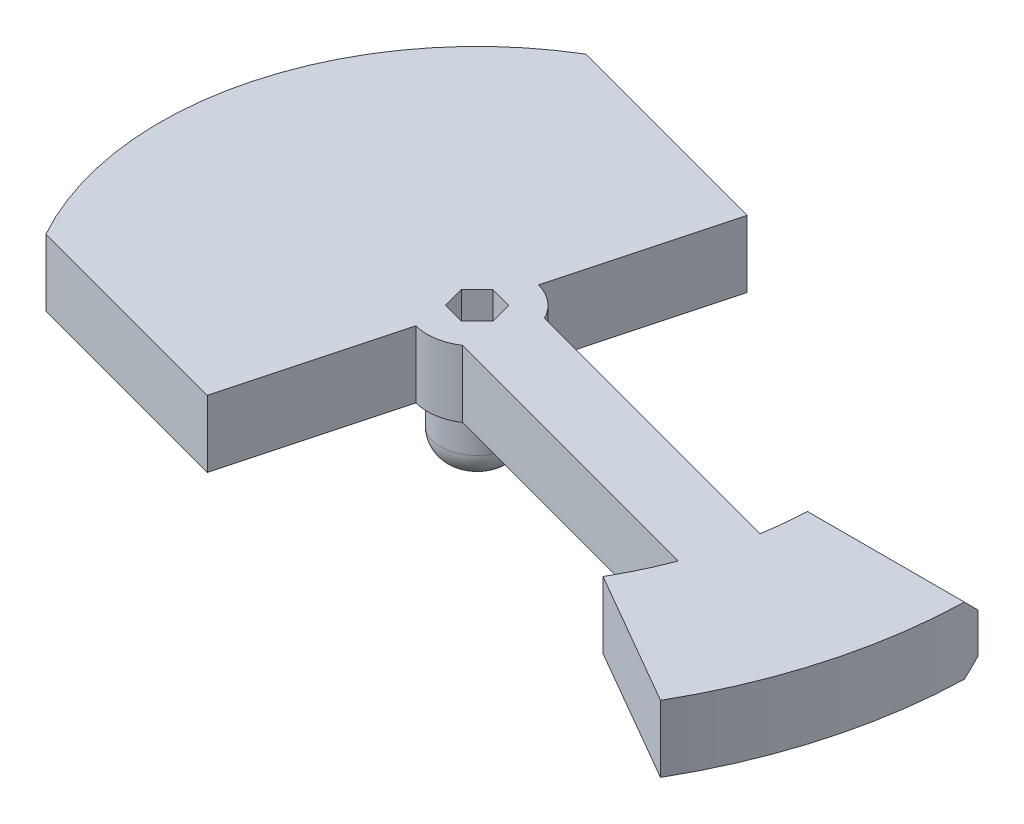
ISO-10303-21;
HEADER;
FILE_DESCRIPTION(('STEP AP214'),'2;1');
FILE_NAME('part.step','',(''),(''),'','','');
FILE_SCHEMA(('AUTOMOTIVE_DESIGN { 1 0 10303 214 1 1 1 1 }'));
ENDSEC;
DATA;
#1=APPLICATION_CONTEXT('core data for automotive mechanical design processes');
#2=APPLICATION_PROTOCOL_DEFINITION('international standard','automotive_design',2000,#1);
#3=PRODUCT_CONTEXT('',#1,'mechanical');
#4=PRODUCT('Part','Part','',(#3));
#5=PRODUCT_RELATED_PRODUCT_CATEGORY('part','',(#4));
#6=PRODUCT_DEFINITION_FORMATION('','',#4);
#7=PRODUCT_DEFINITION_CONTEXT('part definition',#1,'design');
#8=PRODUCT_DEFINITION('design','',#6,#7);
#9=PRODUCT_DEFINITION_SHAPE('','',#8);
#10=(LENGTH_UNIT() NAMED_UNIT(*) SI_UNIT(.MILLI.,.METRE.));
#11=(NAMED_UNIT(*) PLANE_ANGLE_UNIT() SI_UNIT($,.RADIAN.));
#12=(NAMED_UNIT(*) SI_UNIT($,.STERADIAN.) SOLID_ANGLE_UNIT());
#13=UNCERTAINTY_MEASURE_WITH_UNIT(LENGTH_MEASURE(1.E-05),#10,'distance_accuracy_value','');
#14=(GEOMETRIC_REPRESENTATION_CONTEXT(3) GLOBAL_UNCERTAINTY_ASSIGNED_CONTEXT((#13)) GLOBAL_UNIT_ASSIGNED_CONTEXT((#10,
#11,#12)) REPRESENTATION_CONTEXT('',''));
#15=CARTESIAN_POINT('',(0.,0.,0.));
#16=DIRECTION('',(0.,0.,1.));
#17=DIRECTION('',(1.,0.,0.));
#18=AXIS2_PLACEMENT_3D('',#15,#16,#17);
#19=CARTESIAN_POINT('',(0.,12.7,0.));
#20=DIRECTION('',(0.,-1.,0.));
#21=DIRECTION('',(0.,0.,-1.));
#22=AXIS2_PLACEMENT_3D('',#19,#20,#21);
#23=CYLINDRICAL_SURFACE('',#22,60.325);
#24=CARTESIAN_POINT('',(0.,0.,0.));
#25=DIRECTION('',(0.,1.,0.));
#26=DIRECTION('',(0.,0.,1.));
#27=AXIS2_PLACEMENT_3D('',#24,#25,#26);
#28=CIRCLE('',#27,60.325);
#29=CARTESIAN_POINT('',(-31.0640305752503,0.,-51.7120066272806));
#30=VERTEX_POINT('',#29);
#31=CARTESIAN_POINT('',(-52.7582429357436,0.,29.251896132269));
#32=VERTEX_POINT('',#31);
#33=EDGE_CURVE('E340',#30,#32,#28,.T.);
#34=ORIENTED_EDGE('',*,*,#33,.T.);
#35=DIRECTION('',(0.,-1.,0.));
#36=VECTOR('',#35,1.);
#37=CARTESIAN_POINT('',(-52.7582429357436,12.7,29.251896132269));
#38=LINE('',#37,#36);
#39=CARTESIAN_POINT('',(-52.7582429357436,12.7,29.251896132269));
#40=VERTEX_POINT('',#39);
#41=EDGE_CURVE('E397',#40,#32,#38,.T.);
#42=ORIENTED_EDGE('',*,*,#41,.F.);
#43=CARTESIAN_POINT('',(0.,12.7,0.));
#44=DIRECTION('',(0.,1.,0.));
#45=DIRECTION('',(0.,0.,1.));
#46=AXIS2_PLACEMENT_3D('',#43,#44,#45);
#47=CIRCLE('',#46,60.325);
#48=CARTESIAN_POINT('',(-31.0640305752503,12.7,-51.7120066272806));
#49=VERTEX_POINT('',#48);
#50=EDGE_CURVE('E310',#49,#40,#47,.T.);
#51=ORIENTED_EDGE('',*,*,#50,.F.);
#52=DIRECTION('',(0.,-1.,0.));
#53=VECTOR('',#52,1.);
#54=CARTESIAN_POINT('',(-31.0640305752503,12.7,-51.7120066272806));
#55=LINE('',#54,#53);
#56=EDGE_CURVE('E400',#49,#30,#55,.T.);
#57=ORIENTED_EDGE('',*,*,#56,.T.);
#58=EDGE_LOOP('',(#34,#42,#51,#57));
#59=FACE_BOUND('',#58,.T.);
#60=ADVANCED_FACE('F87',(#59),#23,.T.);
#61=CARTESIAN_POINT('',(-10.8471061802467,12.7,40.4819513797748));
#62=DIRECTION('',(0.258819045102522,0.,-0.965925826289068));
#63=DIRECTION('',(-0.965925826289068,0.,-0.258819045102522));
#64=AXIS2_PLACEMENT_3D('',#61,#62,#63);
#65=PLANE('',#64);
#66=DIRECTION('',(0.965925826289068,0.,0.258819045102522));
#67=VECTOR('',#66,1.);
#68=CARTESIAN_POINT('',(-10.8471061802467,0.,40.4819513797748));
#69=LINE('',#68,#67);
#70=CARTESIAN_POINT('',(-10.8471061802467,0.,40.4819513797748));
#71=VERTEX_POINT('',#70);
#72=EDGE_CURVE('E342',#32,#71,#69,.T.);
#73=ORIENTED_EDGE('',*,*,#72,.T.);
#74=DIRECTION('',(0.,-1.,0.));
#75=VECTOR('',#74,1.);
#76=CARTESIAN_POINT('',(-10.8471061802467,12.7,40.4819513797748));
#77=LINE('',#76,#75);
#78=CARTESIAN_POINT('',(-10.8471061802467,12.7,40.4819513797748));
#79=VERTEX_POINT('',#78);
#80=EDGE_CURVE('E394',#79,#71,#77,.T.);
#81=ORIENTED_EDGE('',*,*,#80,.F.);
#82=DIRECTION('',(0.965925826289068,0.,0.258819045102522));
#83=VECTOR('',#82,1.);
#84=CARTESIAN_POINT('',(-10.8471061802467,12.7,40.4819513797748));
#85=LINE('',#84,#83);
#86=EDGE_CURVE('E313',#40,#79,#85,.T.);
#87=ORIENTED_EDGE('',*,*,#86,.F.);
#88=ORIENTED_EDGE('',*,*,#41,.T.);
#89=EDGE_LOOP('',(#73,#81,#87,#88));
#90=FACE_BOUND('',#89,.T.);
#91=ADVANCED_FACE('F464',(#90),#65,.F.);
#92=CARTESIAN_POINT('',(0.,12.7,0.));
#93=DIRECTION('',(-0.965925826289068,0.,-0.258819045102522));
#94=DIRECTION('',(-0.258819045102522,0.,0.965925826289068));
#95=AXIS2_PLACEMENT_3D('',#92,#93,#94);
#96=PLANE('',#95);
#97=DIRECTION('',(0.258819045102522,0.,-0.965925826289068));
#98=VECTOR('',#97,1.);
#99=CARTESIAN_POINT('',(0.,0.,0.));
#100=LINE('',#99,#98);
#101=CARTESIAN_POINT('',(-2.46525140460153,0.,9.20044349540338));
#102=VERTEX_POINT('',#101);
#103=EDGE_CURVE('E344',#71,#102,#100,.T.);
#104=ORIENTED_EDGE('',*,*,#103,.T.);
#105=DIRECTION('',(0.,-1.,0.));
#106=VECTOR('',#105,1.);
#107=CARTESIAN_POINT('',(-2.46525140460153,12.7,9.20044349540338));
#108=LINE('',#107,#106);
#109=CARTESIAN_POINT('',(-2.46525140460153,12.7,9.20044349540338));
#110=VERTEX_POINT('',#109);
#111=EDGE_CURVE('E391',#110,#102,#108,.T.);
#112=ORIENTED_EDGE('',*,*,#111,.F.);
#113=DIRECTION('',(0.258819045102522,0.,-0.965925826289068));
#114=VECTOR('',#113,1.);
#115=CARTESIAN_POINT('',(0.,12.7,0.));
#116=LINE('',#115,#114);
#117=EDGE_CURVE('E315',#79,#110,#116,.T.);
#118=ORIENTED_EDGE('',*,*,#117,.F.);
#119=ORIENTED_EDGE('',*,*,#80,.T.);
#120=EDGE_LOOP('',(#104,#112,#118,#119));
#121=FACE_BOUND('',#120,.T.);
#122=ADVANCED_FACE('F460',(#121),#96,.F.);
#123=CARTESIAN_POINT('',(0.,12.7,0.));
#124=DIRECTION('',(0.,-1.,0.));
#125=DIRECTION('',(0.,0.,-1.));
#126=AXIS2_PLACEMENT_3D('',#123,#124,#125);
#127=CYLINDRICAL_SURFACE('',#126,9.525);
#128=CARTESIAN_POINT('',(0.,0.,0.));
#129=DIRECTION('',(0.,1.,0.));
#130=DIRECTION('',(0.,0.,1.));
#131=AXIS2_PLACEMENT_3D('',#128,#129,#130);
#132=CIRCLE('',#131,9.525);
#133=CARTESIAN_POINT('',(5.21410475655488,0.,7.9711189043742));
#134=VERTEX_POINT('',#133);
#135=EDGE_CURVE('E346',#102,#134,#132,.T.);
#136=ORIENTED_EDGE('',*,*,#135,.T.);
#137=DIRECTION('',(0.,-1.,0.));
#138=VECTOR('',#137,1.);
#139=CARTESIAN_POINT('',(5.21410475655488,12.7,7.9711189043742));
#140=LINE('',#139,#138);
#141=CARTESIAN_POINT('',(5.21410475655488,12.7,7.9711189043742));
#142=VERTEX_POINT('',#141);
#143=EDGE_CURVE('E388',#142,#134,#140,.T.);
#144=ORIENTED_EDGE('',*,*,#143,.F.);
#145=CARTESIAN_POINT('',(0.,12.7,0.));
#146=DIRECTION('',(0.,1.,0.));
#147=DIRECTION('',(0.,0.,1.));
#148=AXIS2_PLACEMENT_3D('',#145,#146,#147);
#149=CIRCLE('',#148,9.525);
#150=EDGE_CURVE('E317',#110,#142,#149,.T.);
#151=ORIENTED_EDGE('',*,*,#150,.F.);
#152=ORIENTED_EDGE('',*,*,#111,.T.);
#153=EDGE_LOOP('',(#136,#144,#151,#152));
#154=FACE_BOUND('',#153,.T.);
#155=ADVANCED_FACE('F455',(#154),#127,.T.);
#156=CARTESIAN_POINT('',(-1.64350093640101,12.7,6.13362899693559));
#157=DIRECTION('',(0.258819045102522,0.,-0.965925826289068));
#158=DIRECTION('',(-0.965925826289068,0.,-0.258819045102522));
#159=AXIS2_PLACEMENT_3D('',#156,#157,#158);
#160=PLANE('',#159);
#161=DIRECTION('',(0.965925826289068,0.,0.258819045102522));
#162=VECTOR('',#161,1.);
#163=CARTESIAN_POINT('',(-1.64350093640101,0.,6.13362899693559));
#164=LINE('',#163,#162);
#165=CARTESIAN_POINT('',(61.2234619884323,0.,22.9787809432421));
#166=VERTEX_POINT('',#165);
#167=EDGE_CURVE('E348',#134,#166,#164,.T.);
#168=ORIENTED_EDGE('',*,*,#167,.T.);
#169=DIRECTION('',(0.,-1.,0.));
#170=VECTOR('',#169,1.);
#171=CARTESIAN_POINT('',(61.2234619884323,12.7,22.9787809432421));
#172=LINE('',#171,#170);
#173=CARTESIAN_POINT('',(61.2234619884323,12.7,22.9787809432421));
#174=VERTEX_POINT('',#173);
#175=EDGE_CURVE('E386',#174,#166,#172,.T.);
#176=ORIENTED_EDGE('',*,*,#175,.F.);
#177=DIRECTION('',(0.965925826289068,0.,0.258819045102522));
#178=VECTOR('',#177,1.);
#179=CARTESIAN_POINT('',(-1.64350093640101,12.7,6.13362899693559));
#180=LINE('',#179,#178);
#181=EDGE_CURVE('E319',#142,#174,#180,.T.);
#182=ORIENTED_EDGE('',*,*,#181,.F.);
#183=ORIENTED_EDGE('',*,*,#143,.T.);
#184=EDGE_LOOP('',(#168,#176,#182,#183));
#185=FACE_BOUND('',#184,.T.);
#186=ADVANCED_FACE('F449',(#185),#160,.F.);
#187=CARTESIAN_POINT('',(0.,12.7,0.));
#188=DIRECTION('',(0.,-1.,0.));
#189=DIRECTION('',(0.,0.,-1.));
#190=AXIS2_PLACEMENT_3D('',#187,#188,#189);
#191=CYLINDRICAL_SURFACE('',#190,65.3937051365537);
#192=CARTESIAN_POINT('',(0.,0.,0.));
#193=DIRECTION('',(0.,1.,0.));
#194=DIRECTION('',(0.,0.,1.));
#195=AXIS2_PLACEMENT_3D('',#192,#193,#194);
#196=CIRCLE('',#195,65.3937051365537);
#197=CARTESIAN_POINT('',(56.6326098958444,0.,32.6968525682769));
#198=VERTEX_POINT('',#197);
#199=EDGE_CURVE('E351',#198,#166,#196,.T.);
#200=ORIENTED_EDGE('',*,*,#199,.F.);
#201=DIRECTION('',(0.,-1.,0.));
#202=VECTOR('',#201,1.);
#203=CARTESIAN_POINT('',(56.6326098958444,12.7,32.6968525682769));
#204=LINE('',#203,#202);
#205=CARTESIAN_POINT('',(56.6326098958444,12.7,32.6968525682769));
#206=VERTEX_POINT('',#205);
#207=EDGE_CURVE('E384',#206,#198,#204,.T.);
#208=ORIENTED_EDGE('',*,*,#207,.F.);
#209=CARTESIAN_POINT('',(0.,12.7,0.));
#210=DIRECTION('',(0.,1.,0.));
#211=DIRECTION('',(0.,0.,1.));
#212=AXIS2_PLACEMENT_3D('',#209,#210,#211);
#213=CIRCLE('',#212,65.3937051365537);
#214=EDGE_CURVE('E321',#206,#174,#213,.T.);
#215=ORIENTED_EDGE('',*,*,#214,.T.);
#216=ORIENTED_EDGE('',*,*,#175,.T.);
#217=EDGE_LOOP('',(#200,#208,#215,#216));
#218=FACE_BOUND('',#217,.T.);
#219=ADVANCED_FACE('F445',(#218),#191,.F.);
#220=CARTESIAN_POINT('',(0.,12.7,0.));
#221=DIRECTION('',(0.500000000000001,0.,-0.866025403784438));
#222=DIRECTION('',(-0.866025403784438,0.,-0.500000000000001));
#223=AXIS2_PLACEMENT_3D('',#220,#221,#222);
#224=PLANE('',#223);
#225=DIRECTION('',(0.866025403784438,0.,0.500000000000001));
#226=VECTOR('',#225,1.);
#227=CARTESIAN_POINT('',(0.,0.,0.));
#228=LINE('',#227,#226);
#229=CARTESIAN_POINT('',(82.4889197104677,0.,47.6250000000001));
#230=VERTEX_POINT('',#229);
#231=EDGE_CURVE('E354',#198,#230,#228,.T.);
#232=ORIENTED_EDGE('',*,*,#231,.T.);
#233=DIRECTION('',(0.,-1.,0.));
#234=VECTOR('',#233,1.);
#235=CARTESIAN_POINT('',(82.4889197104677,12.7,47.6250000000001));
#236=LINE('',#235,#234);
#237=CARTESIAN_POINT('',(82.4889197104677,12.7,47.6250000000001));
#238=VERTEX_POINT('',#237);
#239=EDGE_CURVE('E381',#238,#230,#236,.T.);
#240=ORIENTED_EDGE('',*,*,#239,.F.);
#241=DIRECTION('',(0.866025403784438,0.,0.500000000000001));
#242=VECTOR('',#241,1.);
#243=CARTESIAN_POINT('',(0.,12.7,0.));
#244=LINE('',#243,#242);
#245=EDGE_CURVE('E324',#206,#238,#244,.T.);
#246=ORIENTED_EDGE('',*,*,#245,.F.);
#247=ORIENTED_EDGE('',*,*,#207,.T.);
#248=EDGE_LOOP('',(#232,#240,#246,#247));
#249=FACE_BOUND('',#248,.T.);
#250=ADVANCED_FACE('F440',(#249),#224,.F.);
#251=CARTESIAN_POINT('',(0.,12.7,0.));
#252=DIRECTION('',(0.,-1.,0.));
#253=DIRECTION('',(0.,0.,-1.));
#254=AXIS2_PLACEMENT_3D('',#251,#252,#253);
#255=CYLINDRICAL_SURFACE('',#254,95.25);
#256=CARTESIAN_POINT('',(0.,0.,0.));
#257=DIRECTION('',(0.,1.,0.));
#258=DIRECTION('',(0.,0.,1.));
#259=AXIS2_PLACEMENT_3D('',#256,#257,#258);
#260=CIRCLE('',#259,95.25);
#261=CARTESIAN_POINT('',(95.2161273104509,0.,2.53999999999998));
#262=VERTEX_POINT('',#261);
#263=EDGE_CURVE('E356',#230,#262,#260,.T.);
#264=ORIENTED_EDGE('',*,*,#263,.T.);
#265=CARTESIAN_POINT('',(0.,2.53999999999999,0.));
#266=DIRECTION('',(0.,-0.707106781186548,-0.707106781186548));
#267=DIRECTION('',(0.,-0.707106781186548,0.707106781186548));
#268=AXIS2_PLACEMENT_3D('',#265,#266,#267);
#269=ELLIPSE('',#268,134.703841816037,95.25);
#270=CARTESIAN_POINT('',(95.25,2.53999999999999,0.));
#271=VERTEX_POINT('',#270);
#272=EDGE_CURVE('E408',#262,#271,#269,.F.);
#273=ORIENTED_EDGE('',*,*,#272,.T.);
#274=DIRECTION('',(0.,-1.,0.));
#275=VECTOR('',#274,1.);
#276=CARTESIAN_POINT('',(95.25,12.7,0.));
#277=LINE('',#276,#275);
#278=CARTESIAN_POINT('',(95.25,10.16,0.));
#279=VERTEX_POINT('',#278);
#280=EDGE_CURVE('E379',#279,#271,#277,.T.);
#281=ORIENTED_EDGE('',*,*,#280,.F.);
#282=CARTESIAN_POINT('',(0.,10.16,0.));
#283=DIRECTION('',(0.,-0.707106781186548,0.707106781186548));
#284=DIRECTION('',(0.,-0.707106781186548,-0.707106781186548));
#285=AXIS2_PLACEMENT_3D('',#282,#283,#284);
#286=ELLIPSE('',#285,134.703841816037,95.25);
#287=CARTESIAN_POINT('',(95.2161273104509,12.7,2.53999999999998));
#288=VERTEX_POINT('',#287);
#289=EDGE_CURVE('E406',#279,#288,#286,.T.);
#290=ORIENTED_EDGE('',*,*,#289,.T.);
#291=CARTESIAN_POINT('',(0.,12.7,0.));
#292=DIRECTION('',(0.,1.,0.));
#293=DIRECTION('',(0.,0.,1.));
#294=AXIS2_PLACEMENT_3D('',#291,#292,#293);
#295=CIRCLE('',#294,95.25);
#296=EDGE_CURVE('E326',#238,#288,#295,.T.);
#297=ORIENTED_EDGE('',*,*,#296,.F.);
#298=ORIENTED_EDGE('',*,*,#239,.T.);
#299=EDGE_LOOP('',(#264,#273,#281,#290,#297,#298));
#300=FACE_BOUND('',#299,.T.);
#301=ADVANCED_FACE('F429',(#300),#255,.T.);
#302=CARTESIAN_POINT('',(0.,12.7,0.));
#303=DIRECTION('',(0.,0.,-1.));
#304=DIRECTION('',(-1.,0.,0.));
#305=AXIS2_PLACEMENT_3D('',#302,#303,#304);
#306=PLANE('',#305);
#307=ORIENTED_EDGE('',*,*,#280,.T.);
#308=DIRECTION('',(-1.,0.,0.));
#309=VECTOR('',#308,1.);
#310=CARTESIAN_POINT('',(65.3937051365537,2.53999999999999,0.));
#311=LINE('',#310,#309);
#312=CARTESIAN_POINT('',(65.3937051365537,2.53999999999999,0.));
#313=VERTEX_POINT('',#312);
#314=EDGE_CURVE('E109',#271,#313,#311,.T.);
#315=ORIENTED_EDGE('',*,*,#314,.T.);
#316=DIRECTION('',(0.,-1.,0.));
#317=VECTOR('',#316,1.);
#318=CARTESIAN_POINT('',(65.3937051365537,12.7,0.));
#319=LINE('',#318,#317);
#320=CARTESIAN_POINT('',(65.3937051365537,10.16,0.));
#321=VERTEX_POINT('',#320);
#322=EDGE_CURVE('E377',#321,#313,#319,.T.);
#323=ORIENTED_EDGE('',*,*,#322,.F.);
#324=DIRECTION('',(1.,0.,0.));
#325=VECTOR('',#324,1.);
#326=CARTESIAN_POINT('',(0.,10.16,0.));
#327=LINE('',#326,#325);
#328=EDGE_CURVE('E410',#321,#279,#327,.T.);
#329=ORIENTED_EDGE('',*,*,#328,.T.);
#330=EDGE_LOOP('',(#307,#315,#323,#329));
#331=FACE_BOUND('',#330,.T.);
#332=ADVANCED_FACE('F430',(#331),#306,.T.);
#333=CARTESIAN_POINT('',(0.,12.7,0.));
#334=DIRECTION('',(0.,-1.,0.));
#335=DIRECTION('',(0.,0.,-1.));
#336=AXIS2_PLACEMENT_3D('',#333,#334,#335);
#337=CYLINDRICAL_SURFACE('',#336,65.3937051365537);
#338=ORIENTED_EDGE('',*,*,#322,.T.);
#339=CARTESIAN_POINT('',(0.,2.53999999999999,0.));
#340=DIRECTION('',(0.,-0.707106781186548,-0.707106781186548));
#341=DIRECTION('',(0.,-0.707106781186548,0.707106781186548));
#342=AXIS2_PLACEMENT_3D('',#339,#340,#341);
#343=ELLIPSE('',#342,92.4806646979413,65.3937051365537);
#344=CARTESIAN_POINT('',(65.3443576101757,0.,2.53999999999998));
#345=VERTEX_POINT('',#344);
#346=EDGE_CURVE('E96',#313,#345,#343,.T.);
#347=ORIENTED_EDGE('',*,*,#346,.T.);
#348=CARTESIAN_POINT('',(0.,0.,0.));
#349=DIRECTION('',(0.,1.,0.));
#350=DIRECTION('',(0.,0.,1.));
#351=AXIS2_PLACEMENT_3D('',#348,#349,#350);
#352=CIRCLE('',#351,65.3937051365537);
#353=CARTESIAN_POINT('',(64.5104638612344,0.,10.7115229493709));
#354=VERTEX_POINT('',#353);
#355=EDGE_CURVE('E359',#354,#345,#352,.T.);
#356=ORIENTED_EDGE('',*,*,#355,.F.);
#357=DIRECTION('',(0.,-1.,0.));
#358=VECTOR('',#357,1.);
#359=CARTESIAN_POINT('',(64.5104638612344,12.7,10.7115229493709));
#360=LINE('',#359,#358);
#361=CARTESIAN_POINT('',(64.5104638612344,12.7,10.7115229493709));
#362=VERTEX_POINT('',#361);
#363=EDGE_CURVE('E375',#362,#354,#360,.T.);
#364=ORIENTED_EDGE('',*,*,#363,.F.);
#365=CARTESIAN_POINT('',(0.,12.7,0.));
#366=DIRECTION('',(0.,1.,0.));
#367=DIRECTION('',(0.,0.,1.));
#368=AXIS2_PLACEMENT_3D('',#365,#366,#367);
#369=CIRCLE('',#368,65.3937051365537);
#370=CARTESIAN_POINT('',(65.3443576101757,12.7,2.53999999999998));
#371=VERTEX_POINT('',#370);
#372=EDGE_CURVE('E328',#362,#371,#369,.T.);
#373=ORIENTED_EDGE('',*,*,#372,.T.);
#374=CARTESIAN_POINT('',(0.,10.16,0.));
#375=DIRECTION('',(0.,-0.707106781186548,0.707106781186548));
#376=DIRECTION('',(0.,-0.707106781186548,-0.707106781186548));
#377=AXIS2_PLACEMENT_3D('',#374,#375,#376);
#378=ELLIPSE('',#377,92.4806646979413,65.3937051365537);
#379=EDGE_CURVE('E414',#371,#321,#378,.F.);
#380=ORIENTED_EDGE('',*,*,#379,.T.);
#381=EDGE_LOOP('',(#338,#347,#356,#364,#373,#380));
#382=FACE_BOUND('',#381,.T.);
#383=ADVANCED_FACE('F418',(#382),#337,.F.);
#384=CARTESIAN_POINT('',(1.64350093640102,12.7,-6.1336289969356));
#385=DIRECTION('',(0.258819045102522,0.,-0.965925826289068));
#386=DIRECTION('',(-0.965925826289068,0.,-0.258819045102522));
#387=AXIS2_PLACEMENT_3D('',#384,#385,#386);
#388=PLANE('',#387);
#389=DIRECTION('',(0.965925826289068,0.,0.258819045102522));
#390=VECTOR('',#389,1.);
#391=CARTESIAN_POINT('',(1.64350093640102,0.,-6.1336289969356));
#392=LINE('',#391,#390);
#393=CARTESIAN_POINT('',(8.50110662935692,0.,-4.29613908949699));
#394=VERTEX_POINT('',#393);
#395=EDGE_CURVE('E362',#394,#354,#392,.T.);
#396=ORIENTED_EDGE('',*,*,#395,.F.);
#397=DIRECTION('',(0.,-1.,0.));
#398=VECTOR('',#397,1.);
#399=CARTESIAN_POINT('',(8.50110662935692,12.7,-4.29613908949699));
#400=LINE('',#399,#398);
#401=CARTESIAN_POINT('',(8.50110662935692,12.7,-4.29613908949699));
#402=VERTEX_POINT('',#401);
#403=EDGE_CURVE('E373',#402,#394,#400,.T.);
#404=ORIENTED_EDGE('',*,*,#403,.F.);
#405=DIRECTION('',(0.965925826289068,0.,0.258819045102522));
#406=VECTOR('',#405,1.);
#407=CARTESIAN_POINT('',(1.64350093640102,12.7,-6.1336289969356));
#408=LINE('',#407,#406);
#409=EDGE_CURVE('E330',#402,#362,#408,.T.);
#410=ORIENTED_EDGE('',*,*,#409,.T.);
#411=ORIENTED_EDGE('',*,*,#363,.T.);
#412=EDGE_LOOP('',(#396,#404,#410,#411));
#413=FACE_BOUND('',#412,.T.);
#414=ADVANCED_FACE('F480',(#413),#388,.T.);
#415=CARTESIAN_POINT('',(0.,12.7,0.));
#416=DIRECTION('',(0.,-1.,0.));
#417=DIRECTION('',(0.,0.,-1.));
#418=AXIS2_PLACEMENT_3D('',#415,#416,#417);
#419=CYLINDRICAL_SURFACE('',#418,9.52500000000001);
#420=CARTESIAN_POINT('',(0.,0.,0.));
#421=DIRECTION('',(0.,1.,0.));
#422=DIRECTION('',(0.,0.,1.));
#423=AXIS2_PLACEMENT_3D('',#420,#421,#422);
#424=CIRCLE('',#423,9.52500000000001);
#425=CARTESIAN_POINT('',(2.46525140460152,0.,-9.20044349540338));
#426=VERTEX_POINT('',#425);
#427=EDGE_CURVE('E365',#394,#426,#424,.T.);
#428=ORIENTED_EDGE('',*,*,#427,.T.);
#429=DIRECTION('',(0.,-1.,0.));
#430=VECTOR('',#429,1.);
#431=CARTESIAN_POINT('',(2.46525140460152,12.7,-9.20044349540338));
#432=LINE('',#431,#430);
#433=CARTESIAN_POINT('',(2.46525140460152,12.7,-9.20044349540338));
#434=VERTEX_POINT('',#433);
#435=EDGE_CURVE('E370',#434,#426,#432,.T.);
#436=ORIENTED_EDGE('',*,*,#435,.F.);
#437=CARTESIAN_POINT('',(0.,12.7,0.));
#438=DIRECTION('',(0.,1.,0.));
#439=DIRECTION('',(0.,0.,1.));
#440=AXIS2_PLACEMENT_3D('',#437,#438,#439);
#441=CIRCLE('',#440,9.52500000000001);
#442=EDGE_CURVE('E333',#402,#434,#441,.T.);
#443=ORIENTED_EDGE('',*,*,#442,.F.);
#444=ORIENTED_EDGE('',*,*,#403,.T.);
#445=EDGE_LOOP('',(#428,#436,#443,#444));
#446=FACE_BOUND('',#445,.T.);
#447=ADVANCED_FACE('F483',(#446),#419,.T.);
#448=CARTESIAN_POINT('',(0.,12.7,0.));
#449=DIRECTION('',(-0.965925826289068,0.,-0.258819045102522));
#450=DIRECTION('',(-0.258819045102522,0.,0.965925826289068));
#451=AXIS2_PLACEMENT_3D('',#448,#449,#450);
#452=PLANE('',#451);
#453=DIRECTION('',(0.258819045102522,0.,-0.965925826289068));
#454=VECTOR('',#453,1.);
#455=CARTESIAN_POINT('',(0.,0.,0.));
#456=LINE('',#455,#454);
#457=CARTESIAN_POINT('',(10.8471061802467,0.,-40.4819513797748));
#458=VERTEX_POINT('',#457);
#459=EDGE_CURVE('E311',#426,#458,#456,.T.);
#460=ORIENTED_EDGE('',*,*,#459,.T.);
#461=DIRECTION('',(0.,-1.,0.));
#462=VECTOR('',#461,1.);
#463=CARTESIAN_POINT('',(10.8471061802467,12.7,-40.4819513797748));
#464=LINE('',#463,#462);
#465=CARTESIAN_POINT('',(10.8471061802467,12.7,-40.4819513797748));
#466=VERTEX_POINT('',#465);
#467=EDGE_CURVE('E337',#466,#458,#464,.T.);
#468=ORIENTED_EDGE('',*,*,#467,.F.);
#469=DIRECTION('',(0.258819045102522,0.,-0.965925826289068));
#470=VECTOR('',#469,1.);
#471=CARTESIAN_POINT('',(0.,12.7,0.));
#472=LINE('',#471,#470);
#473=EDGE_CURVE('E335',#434,#466,#472,.T.);
#474=ORIENTED_EDGE('',*,*,#473,.F.);
#475=ORIENTED_EDGE('',*,*,#435,.T.);
#476=EDGE_LOOP('',(#460,#468,#474,#475));
#477=FACE_BOUND('',#476,.T.);
#478=ADVANCED_FACE('F476',(#477),#452,.F.);
#479=CARTESIAN_POINT('',(10.8471061802467,12.7,-40.4819513797748));
#480=DIRECTION('',(-0.258819045102522,0.,0.965925826289068));
#481=DIRECTION('',(0.965925826289068,0.,0.258819045102522));
#482=AXIS2_PLACEMENT_3D('',#479,#480,#481);
#483=PLANE('',#482);
#484=DIRECTION('',(-0.965925826289068,0.,-0.258819045102522));
#485=VECTOR('',#484,1.);
#486=CARTESIAN_POINT('',(10.8471061802467,0.,-40.4819513797748));
#487=LINE('',#486,#485);
#488=EDGE_CURVE('E306',#458,#30,#487,.T.);
#489=ORIENTED_EDGE('',*,*,#488,.T.);
#490=ORIENTED_EDGE('',*,*,#56,.F.);
#491=DIRECTION('',(-0.965925826289068,0.,-0.258819045102522));
#492=VECTOR('',#491,1.);
#493=CARTESIAN_POINT('',(10.8471061802467,12.7,-40.4819513797748));
#494=LINE('',#493,#492);
#495=EDGE_CURVE('E307',#466,#49,#494,.T.);
#496=ORIENTED_EDGE('',*,*,#495,.F.);
#497=ORIENTED_EDGE('',*,*,#467,.T.);
#498=EDGE_LOOP('',(#489,#490,#496,#497));
#499=FACE_BOUND('',#498,.T.);
#500=ADVANCED_FACE('F472',(#499),#483,.F.);
#501=CARTESIAN_POINT('',(0.,0.,0.));
#502=DIRECTION('',(0.,1.,0.));
#503=DIRECTION('',(0.,0.,1.));
#504=AXIS2_PLACEMENT_3D('',#501,#502,#503);
#505=PLANE('',#504);
#506=CARTESIAN_POINT('',(0.,0.,0.));
#507=DIRECTION('',(0.,-1.,0.));
#508=DIRECTION('',(0.,0.,-1.));
#509=AXIS2_PLACEMENT_3D('',#506,#507,#508);
#510=CIRCLE('',#509,6.985);
#511=CARTESIAN_POINT('',(0.,0.,-6.985));
#512=VERTEX_POINT('',#511);
#513=EDGE_CURVE('E290',#512,#512,#510,.T.);
#514=ORIENTED_EDGE('',*,*,#513,.F.);
#515=EDGE_LOOP('',(#514));
#516=FACE_BOUND('',#515,.T.);
#517=ORIENTED_EDGE('',*,*,#355,.T.);
#518=DIRECTION('',(1.,0.,0.));
#519=VECTOR('',#518,1.);
#520=CARTESIAN_POINT('',(95.25,0.,2.53999999999998));
#521=LINE('',#520,#519);
#522=EDGE_CURVE('E403',#345,#262,#521,.T.);
#523=ORIENTED_EDGE('',*,*,#522,.T.);
#524=ORIENTED_EDGE('',*,*,#263,.F.);
#525=ORIENTED_EDGE('',*,*,#231,.F.);
#526=ORIENTED_EDGE('',*,*,#199,.T.);
#527=ORIENTED_EDGE('',*,*,#167,.F.);
#528=ORIENTED_EDGE('',*,*,#135,.F.);
#529=ORIENTED_EDGE('',*,*,#103,.F.);
#530=ORIENTED_EDGE('',*,*,#72,.F.);
#531=ORIENTED_EDGE('',*,*,#33,.F.);
#532=ORIENTED_EDGE('',*,*,#488,.F.);
#533=ORIENTED_EDGE('',*,*,#459,.F.);
#534=ORIENTED_EDGE('',*,*,#427,.F.);
#535=ORIENTED_EDGE('',*,*,#395,.T.);
#536=EDGE_LOOP('',(#517,#523,#524,#525,#526,#527,#528,#529,#530,#531,#532,#533,#534,#535));
#537=FACE_BOUND('',#536,.T.);
#538=ADVANCED_FACE('F422',(#516,#537),#505,.F.);
#539=CARTESIAN_POINT('',(0.,12.7,0.));
#540=DIRECTION('',(0.,1.,0.));
#541=DIRECTION('',(0.,0.,1.));
#542=AXIS2_PLACEMENT_3D('',#539,#540,#541);
#543=PLANE('',#542);
#544=DIRECTION('',(-0.25881904510252,0.,-0.965925826289068));
#545=VECTOR('',#544,1.);
#546=CARTESIAN_POINT('',(4.10785272888846,12.7,1.10069582133165));
#547=LINE('',#546,#545);
#548=CARTESIAN_POINT('',(4.10785272888846,12.7,1.10069582133165));
#549=VERTEX_POINT('',#548);
#550=CARTESIAN_POINT('',(3.00715690755682,12.7,-3.00715690755681));
#551=VERTEX_POINT('',#550);
#552=EDGE_CURVE('E246',#549,#551,#547,.T.);
#553=ORIENTED_EDGE('',*,*,#552,.F.);
#554=DIRECTION('',(0.707106781186548,0.,-0.707106781186547));
#555=VECTOR('',#554,1.);
#556=CARTESIAN_POINT('',(1.10069582133164,12.7,4.10785272888846));
#557=LINE('',#556,#555);
#558=CARTESIAN_POINT('',(1.10069582133164,12.7,4.10785272888846));
#559=VERTEX_POINT('',#558);
#560=EDGE_CURVE('E264',#559,#549,#557,.T.);
#561=ORIENTED_EDGE('',*,*,#560,.F.);
#562=DIRECTION('',(0.965925826289068,0.,0.258819045102522));
#563=VECTOR('',#562,1.);
#564=CARTESIAN_POINT('',(-3.00715690755682,12.7,3.00715690755681));
#565=LINE('',#564,#563);
#566=CARTESIAN_POINT('',(-3.00715690755682,12.7,3.00715690755681));
#567=VERTEX_POINT('',#566);
#568=EDGE_CURVE('E267',#567,#559,#565,.T.);
#569=ORIENTED_EDGE('',*,*,#568,.F.);
#570=DIRECTION('',(0.25881904510252,0.,0.965925826289068));
#571=VECTOR('',#570,1.);
#572=CARTESIAN_POINT('',(-4.10785272888846,12.7,-1.10069582133165));
#573=LINE('',#572,#571);
#574=CARTESIAN_POINT('',(-4.10785272888846,12.7,-1.10069582133165));
#575=VERTEX_POINT('',#574);
#576=EDGE_CURVE('E283',#575,#567,#573,.T.);
#577=ORIENTED_EDGE('',*,*,#576,.F.);
#578=DIRECTION('',(-0.707106781186548,0.,0.707106781186547));
#579=VECTOR('',#578,1.);
#580=CARTESIAN_POINT('',(-1.10069582133164,12.7,-4.10785272888846));
#581=LINE('',#580,#579);
#582=CARTESIAN_POINT('',(-1.10069582133164,12.7,-4.10785272888846));
#583=VERTEX_POINT('',#582);
#584=EDGE_CURVE('E280',#583,#575,#581,.T.);
#585=ORIENTED_EDGE('',*,*,#584,.F.);
#586=DIRECTION('',(-0.965925826289068,0.,-0.258819045102521));
#587=VECTOR('',#586,1.);
#588=CARTESIAN_POINT('',(3.00715690755682,12.7,-3.00715690755681));
#589=LINE('',#588,#587);
#590=EDGE_CURVE('E278',#551,#583,#589,.T.);
#591=ORIENTED_EDGE('',*,*,#590,.F.);
#592=EDGE_LOOP('',(#553,#561,#569,#577,#585,#591));
#593=FACE_BOUND('',#592,.T.);
#594=ORIENTED_EDGE('',*,*,#296,.T.);
#595=DIRECTION('',(-1.,0.,0.));
#596=VECTOR('',#595,1.);
#597=CARTESIAN_POINT('',(0.,12.7,2.53999999999999));
#598=LINE('',#597,#596);
#599=EDGE_CURVE('E12',#288,#371,#598,.T.);
#600=ORIENTED_EDGE('',*,*,#599,.T.);
#601=ORIENTED_EDGE('',*,*,#372,.F.);
#602=ORIENTED_EDGE('',*,*,#409,.F.);
#603=ORIENTED_EDGE('',*,*,#442,.T.);
#604=ORIENTED_EDGE('',*,*,#473,.T.);
#605=ORIENTED_EDGE('',*,*,#495,.T.);
#606=ORIENTED_EDGE('',*,*,#50,.T.);
#607=ORIENTED_EDGE('',*,*,#86,.T.);
#608=ORIENTED_EDGE('',*,*,#117,.T.);
#609=ORIENTED_EDGE('',*,*,#150,.T.);
#610=ORIENTED_EDGE('',*,*,#181,.T.);
#611=ORIENTED_EDGE('',*,*,#214,.F.);
#612=ORIENTED_EDGE('',*,*,#245,.T.);
#613=EDGE_LOOP('',(#594,#600,#601,#602,#603,#604,#605,#606,#607,#608,#609,#610,#611,#612));
#614=FACE_BOUND('',#613,.T.);
#615=ADVANCED_FACE('F435',(#593,#614),#543,.T.);
#616=CARTESIAN_POINT('',(1.905,-12.192,0.));
#617=DIRECTION('',(0.,-1.,0.));
#618=DIRECTION('',(0.,0.,-1.));
#619=AXIS2_PLACEMENT_3D('',#616,#617,#618);
#620=PLANE('',#619);
#621=CARTESIAN_POINT('',(0.,-12.192,0.));
#622=DIRECTION('',(0.,-1.,0.));
#623=DIRECTION('',(0.,0.,-1.));
#624=AXIS2_PLACEMENT_3D('',#621,#622,#623);
#625=CIRCLE('',#624,1.905);
#626=CARTESIAN_POINT('',(0.,-12.192,-1.905));
#627=VERTEX_POINT('',#626);
#628=EDGE_CURVE('E303',#627,#627,#625,.T.);
#629=ORIENTED_EDGE('',*,*,#628,.T.);
#630=EDGE_LOOP('',(#629));
#631=FACE_BOUND('',#630,.T.);
#632=ADVANCED_FACE('F540',(#631),#620,.T.);
#633=CARTESIAN_POINT('',(0.,-7.112,0.));
#634=DIRECTION('',(0.,-1.,0.));
#635=DIRECTION('',(0.,0.,-1.));
#636=AXIS2_PLACEMENT_3D('',#633,#634,#635);
#637=DEGENERATE_TOROIDAL_SURFACE('',#636,1.905,5.08,.T.);
#638=CARTESIAN_POINT('',(0.,-7.112,0.));
#639=DIRECTION('',(0.,-1.,0.));
#640=DIRECTION('',(0.,0.,-1.));
#641=AXIS2_PLACEMENT_3D('',#638,#639,#640);
#642=CIRCLE('',#641,6.985);
#643=CARTESIAN_POINT('',(0.,-7.112,-6.985));
#644=VERTEX_POINT('',#643);
#645=EDGE_CURVE('E300',#644,#644,#642,.T.);
#646=ORIENTED_EDGE('',*,*,#645,.T.);
#647=EDGE_LOOP('',(#646));
#648=FACE_BOUND('',#647,.T.);
#649=ORIENTED_EDGE('',*,*,#628,.F.);
#650=EDGE_LOOP('',(#649));
#651=FACE_BOUND('',#650,.T.);
#652=ADVANCED_FACE('F536',(#648,#651),#637,.T.);
#653=CARTESIAN_POINT('',(0.,-12.192,0.));
#654=DIRECTION('',(0.,-1.,0.));
#655=DIRECTION('',(0.,0.,-1.));
#656=AXIS2_PLACEMENT_3D('',#653,#654,#655);
#657=CYLINDRICAL_SURFACE('',#656,6.985);
#658=ORIENTED_EDGE('',*,*,#513,.T.);
#659=EDGE_LOOP('',(#658));
#660=FACE_BOUND('',#659,.T.);
#661=ORIENTED_EDGE('',*,*,#645,.F.);
#662=EDGE_LOOP('',(#661));
#663=FACE_BOUND('',#662,.T.);
#664=ADVANCED_FACE('F533',(#660,#663),#657,.T.);
#665=CARTESIAN_POINT('',(4.10785272888846,-2.54,1.10069582133165));
#666=DIRECTION('',(0.965925826289068,0.,-0.25881904510252));
#667=DIRECTION('',(-0.25881904510252,0.,-0.965925826289068));
#668=AXIS2_PLACEMENT_3D('',#665,#666,#667);
#669=PLANE('',#668);
#670=ORIENTED_EDGE('',*,*,#552,.T.);
#671=DIRECTION('',(0.,1.,0.));
#672=VECTOR('',#671,1.);
#673=CARTESIAN_POINT('',(3.00715690755682,-2.54,-3.00715690755681));
#674=LINE('',#673,#672);
#675=CARTESIAN_POINT('',(3.00715690755682,-2.54,-3.00715690755681));
#676=VERTEX_POINT('',#675);
#677=EDGE_CURVE('E239',#676,#551,#674,.T.);
#678=ORIENTED_EDGE('',*,*,#677,.F.);
#679=DIRECTION('',(-0.25881904510252,0.,-0.965925826289068));
#680=VECTOR('',#679,1.);
#681=CARTESIAN_POINT('',(4.10785272888846,-2.54,1.10069582133165));
#682=LINE('',#681,#680);
#683=CARTESIAN_POINT('',(4.10785272888846,-2.54,1.10069582133165));
#684=VERTEX_POINT('',#683);
#685=EDGE_CURVE('E243',#684,#676,#682,.T.);
#686=ORIENTED_EDGE('',*,*,#685,.F.);
#687=DIRECTION('',(0.,1.,0.));
#688=VECTOR('',#687,1.);
#689=CARTESIAN_POINT('',(4.10785272888846,-2.54,1.10069582133165));
#690=LINE('',#689,#688);
#691=EDGE_CURVE('E288',#684,#549,#690,.T.);
#692=ORIENTED_EDGE('',*,*,#691,.T.);
#693=EDGE_LOOP('',(#670,#678,#686,#692));
#694=FACE_BOUND('',#693,.T.);
#695=ADVANCED_FACE('F241',(#694),#669,.F.);
#696=CARTESIAN_POINT('',(1.10069582133164,-2.54,4.10785272888846));
#697=DIRECTION('',(0.707106781186547,0.,0.707106781186548));
#698=DIRECTION('',(0.707106781186548,0.,-0.707106781186547));
#699=AXIS2_PLACEMENT_3D('',#696,#697,#698);
#700=PLANE('',#699);
#701=ORIENTED_EDGE('',*,*,#560,.T.);
#702=ORIENTED_EDGE('',*,*,#691,.F.);
#703=DIRECTION('',(0.707106781186548,0.,-0.707106781186547));
#704=VECTOR('',#703,1.);
#705=CARTESIAN_POINT('',(1.10069582133164,-2.54,4.10785272888846));
#706=LINE('',#705,#704);
#707=CARTESIAN_POINT('',(1.10069582133164,-2.54,4.10785272888846));
#708=VERTEX_POINT('',#707);
#709=EDGE_CURVE('E251',#708,#684,#706,.T.);
#710=ORIENTED_EDGE('',*,*,#709,.F.);
#711=DIRECTION('',(0.,1.,0.));
#712=VECTOR('',#711,1.);
#713=CARTESIAN_POINT('',(1.10069582133164,-2.54,4.10785272888846));
#714=LINE('',#713,#712);
#715=EDGE_CURVE('E291',#708,#559,#714,.T.);
#716=ORIENTED_EDGE('',*,*,#715,.T.);
#717=EDGE_LOOP('',(#701,#702,#710,#716));
#718=FACE_BOUND('',#717,.T.);
#719=ADVANCED_FACE('F516',(#718),#700,.F.);
#720=CARTESIAN_POINT('',(-3.00715690755682,-2.54,3.00715690755681));
#721=DIRECTION('',(-0.258819045102522,0.,0.965925826289068));
#722=DIRECTION('',(0.965925826289068,0.,0.258819045102522));
#723=AXIS2_PLACEMENT_3D('',#720,#721,#722);
#724=PLANE('',#723);
#725=ORIENTED_EDGE('',*,*,#568,.T.);
#726=ORIENTED_EDGE('',*,*,#715,.F.);
#727=DIRECTION('',(0.965925826289068,0.,0.258819045102522));
#728=VECTOR('',#727,1.);
#729=CARTESIAN_POINT('',(-3.00715690755682,-2.54,3.00715690755681));
#730=LINE('',#729,#728);
#731=CARTESIAN_POINT('',(-3.00715690755682,-2.54,3.00715690755681));
#732=VERTEX_POINT('',#731);
#733=EDGE_CURVE('E274',#732,#708,#730,.T.);
#734=ORIENTED_EDGE('',*,*,#733,.F.);
#735=DIRECTION('',(0.,1.,0.));
#736=VECTOR('',#735,1.);
#737=CARTESIAN_POINT('',(-3.00715690755682,-2.54,3.00715690755681));
#738=LINE('',#737,#736);
#739=EDGE_CURVE('E293',#732,#567,#738,.T.);
#740=ORIENTED_EDGE('',*,*,#739,.T.);
#741=EDGE_LOOP('',(#725,#726,#734,#740));
#742=FACE_BOUND('',#741,.T.);
#743=ADVANCED_FACE('F519',(#742),#724,.F.);
#744=CARTESIAN_POINT('',(-4.10785272888846,-2.54,-1.10069582133165));
#745=DIRECTION('',(-0.965925826289068,0.,0.25881904510252));
#746=DIRECTION('',(0.25881904510252,0.,0.965925826289068));
#747=AXIS2_PLACEMENT_3D('',#744,#745,#746);
#748=PLANE('',#747);
#749=ORIENTED_EDGE('',*,*,#576,.T.);
#750=ORIENTED_EDGE('',*,*,#739,.F.);
#751=DIRECTION('',(0.25881904510252,0.,0.965925826289068));
#752=VECTOR('',#751,1.);
#753=CARTESIAN_POINT('',(-4.10785272888846,-2.54,-1.10069582133165));
#754=LINE('',#753,#752);
#755=CARTESIAN_POINT('',(-4.10785272888846,-2.54,-1.10069582133165));
#756=VERTEX_POINT('',#755);
#757=EDGE_CURVE('E271',#756,#732,#754,.T.);
#758=ORIENTED_EDGE('',*,*,#757,.F.);
#759=DIRECTION('',(0.,1.,0.));
#760=VECTOR('',#759,1.);
#761=CARTESIAN_POINT('',(-4.10785272888846,-2.54,-1.10069582133165));
#762=LINE('',#761,#760);
#763=EDGE_CURVE('E295',#756,#575,#762,.T.);
#764=ORIENTED_EDGE('',*,*,#763,.T.);
#765=EDGE_LOOP('',(#749,#750,#758,#764));
#766=FACE_BOUND('',#765,.T.);
#767=ADVANCED_FACE('F523',(#766),#748,.F.);
#768=CARTESIAN_POINT('',(-1.10069582133164,-2.54,-4.10785272888846));
#769=DIRECTION('',(-0.707106781186547,0.,-0.707106781186548));
#770=DIRECTION('',(-0.707106781186548,0.,0.707106781186547));
#771=AXIS2_PLACEMENT_3D('',#768,#769,#770);
#772=PLANE('',#771);
#773=ORIENTED_EDGE('',*,*,#584,.T.);
#774=ORIENTED_EDGE('',*,*,#763,.F.);
#775=DIRECTION('',(-0.707106781186548,0.,0.707106781186547));
#776=VECTOR('',#775,1.);
#777=CARTESIAN_POINT('',(-1.10069582133164,-2.54,-4.10785272888846));
#778=LINE('',#777,#776);
#779=CARTESIAN_POINT('',(-1.10069582133164,-2.54,-4.10785272888846));
#780=VERTEX_POINT('',#779);
#781=EDGE_CURVE('E259',#780,#756,#778,.T.);
#782=ORIENTED_EDGE('',*,*,#781,.F.);
#783=DIRECTION('',(0.,1.,0.));
#784=VECTOR('',#783,1.);
#785=CARTESIAN_POINT('',(-1.10069582133164,-2.54,-4.10785272888846));
#786=LINE('',#785,#784);
#787=EDGE_CURVE('E250',#780,#583,#786,.T.);
#788=ORIENTED_EDGE('',*,*,#787,.T.);
#789=EDGE_LOOP('',(#773,#774,#782,#788));
#790=FACE_BOUND('',#789,.T.);
#791=ADVANCED_FACE('F513',(#790),#772,.F.);
#792=CARTESIAN_POINT('',(3.00715690755682,-2.54,-3.00715690755681));
#793=DIRECTION('',(0.258819045102521,0.,-0.965925826289068));
#794=DIRECTION('',(-0.965925826289068,0.,-0.258819045102521));
#795=AXIS2_PLACEMENT_3D('',#792,#793,#794);
#796=PLANE('',#795);
#797=ORIENTED_EDGE('',*,*,#590,.T.);
#798=ORIENTED_EDGE('',*,*,#787,.F.);
#799=DIRECTION('',(-0.965925826289068,0.,-0.258819045102521));
#800=VECTOR('',#799,1.);
#801=CARTESIAN_POINT('',(3.00715690755682,-2.54,-3.00715690755681));
#802=LINE('',#801,#800);
#803=EDGE_CURVE('E254',#676,#780,#802,.T.);
#804=ORIENTED_EDGE('',*,*,#803,.F.);
#805=ORIENTED_EDGE('',*,*,#677,.T.);
#806=EDGE_LOOP('',(#797,#798,#804,#805));
#807=FACE_BOUND('',#806,.T.);
#808=ADVANCED_FACE('F255',(#807),#796,.F.);
#809=CARTESIAN_POINT('',(0.,-2.54,0.));
#810=DIRECTION('',(0.,1.,0.));
#811=DIRECTION('',(0.,0.,1.));
#812=AXIS2_PLACEMENT_3D('',#809,#810,#811);
#813=PLANE('',#812);
#814=ORIENTED_EDGE('',*,*,#685,.T.);
#815=ORIENTED_EDGE('',*,*,#803,.T.);
#816=ORIENTED_EDGE('',*,*,#781,.T.);
#817=ORIENTED_EDGE('',*,*,#757,.T.);
#818=ORIENTED_EDGE('',*,*,#733,.T.);
#819=ORIENTED_EDGE('',*,*,#709,.T.);
#820=EDGE_LOOP('',(#814,#815,#816,#817,#818,#819));
#821=FACE_BOUND('',#820,.T.);
#822=ADVANCED_FACE('F261',(#821),#813,.T.);
#823=CARTESIAN_POINT('',(0.,0.,2.53999999999999));
#824=DIRECTION('',(0.,-0.707106781186548,-0.707106781186548));
#825=DIRECTION('',(-1.,0.,0.));
#826=AXIS2_PLACEMENT_3D('',#823,#824,#825);
#827=PLANE('',#826);
#828=ORIENTED_EDGE('',*,*,#346,.F.);
#829=ORIENTED_EDGE('',*,*,#314,.F.);
#830=ORIENTED_EDGE('',*,*,#272,.F.);
#831=ORIENTED_EDGE('',*,*,#522,.F.);
#832=EDGE_LOOP('',(#828,#829,#830,#831));
#833=FACE_BOUND('',#832,.T.);
#834=ADVANCED_FACE('F426',(#833),#827,.T.);
#835=CARTESIAN_POINT('',(0.,10.16,0.));
#836=DIRECTION('',(0.,-0.707106781186548,0.707106781186548));
#837=DIRECTION('',(1.,0.,0.));
#838=AXIS2_PLACEMENT_3D('',#835,#836,#837);
#839=PLANE('',#838);
#840=ORIENTED_EDGE('',*,*,#379,.F.);
#841=ORIENTED_EDGE('',*,*,#599,.F.);
#842=ORIENTED_EDGE('',*,*,#289,.F.);
#843=ORIENTED_EDGE('',*,*,#328,.F.);
#844=EDGE_LOOP('',(#840,#841,#842,#843));
#845=FACE_BOUND('',#844,.T.);
#846=ADVANCED_FACE('F90',(#845),#839,.F.);
#847=CLOSED_SHELL('',(#60,#91,#122,#155,#186,#219,#250,#301,#332,#383,#414,#447,#478,#500,#538,
#615,#632,#652,#664,#695,#719,#743,#767,#791,#808,#822,#834,#846));
#848=MANIFOLD_SOLID_BREP('B2',#847);
#849=ADVANCED_BREP_SHAPE_REPRESENTATION('',(#18,#848),#14);
#850=SHAPE_DEFINITION_REPRESENTATION(#9,#849);
ENDSEC;
END-ISO-10303-21;
